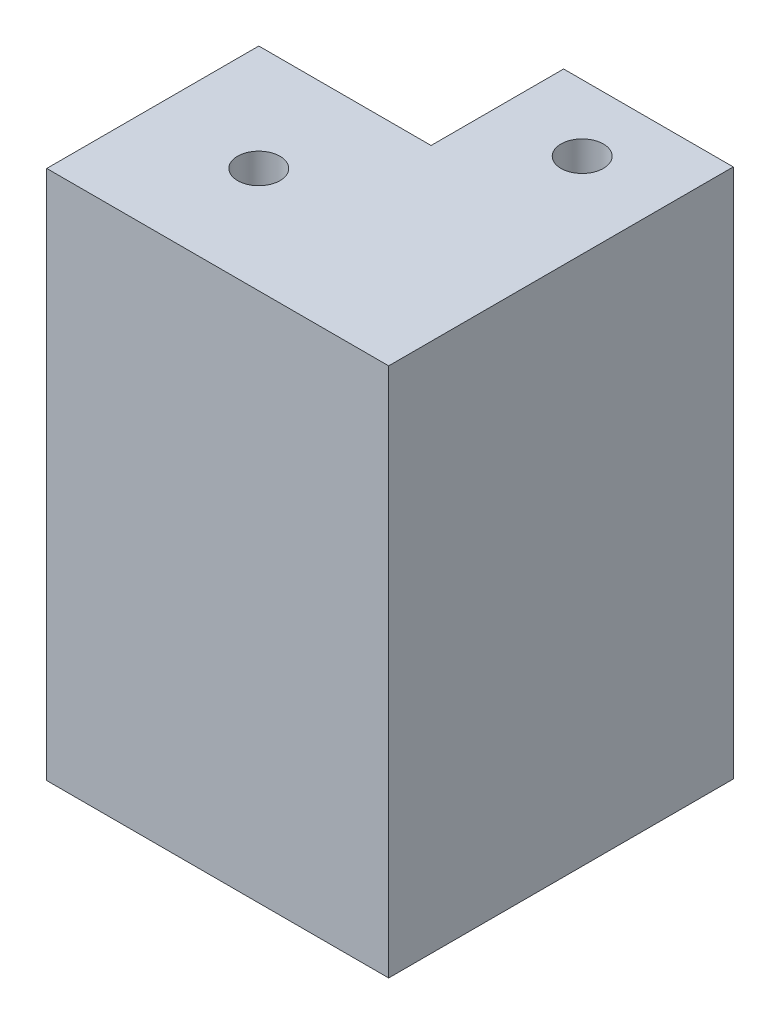
ISO-10303-21;
HEADER;
FILE_DESCRIPTION(('STEP AP214'),'2;1');
FILE_NAME('part.step','',(''),(''),'','','');
FILE_SCHEMA(('AUTOMOTIVE_DESIGN { 1 0 10303 214 1 1 1 1 }'));
ENDSEC;
DATA;
#1=APPLICATION_CONTEXT('core data for automotive mechanical design processes');
#2=APPLICATION_PROTOCOL_DEFINITION('international standard','automotive_design',2000,#1);
#3=PRODUCT_CONTEXT('',#1,'mechanical');
#4=PRODUCT('Part','Part','',(#3));
#5=PRODUCT_RELATED_PRODUCT_CATEGORY('part','',(#4));
#6=PRODUCT_DEFINITION_FORMATION('','',#4);
#7=PRODUCT_DEFINITION_CONTEXT('part definition',#1,'design');
#8=PRODUCT_DEFINITION('design','',#6,#7);
#9=PRODUCT_DEFINITION_SHAPE('','',#8);
#10=(LENGTH_UNIT() NAMED_UNIT(*) SI_UNIT(.MILLI.,.METRE.));
#11=(NAMED_UNIT(*) PLANE_ANGLE_UNIT() SI_UNIT($,.RADIAN.));
#12=(NAMED_UNIT(*) SI_UNIT($,.STERADIAN.) SOLID_ANGLE_UNIT());
#13=UNCERTAINTY_MEASURE_WITH_UNIT(LENGTH_MEASURE(1.E-05),#10,'distance_accuracy_value','');
#14=(GEOMETRIC_REPRESENTATION_CONTEXT(3) GLOBAL_UNCERTAINTY_ASSIGNED_CONTEXT((#13)) GLOBAL_UNIT_ASSIGNED_CONTEXT((#10,
#11,#12)) REPRESENTATION_CONTEXT('',''));
#15=CARTESIAN_POINT('',(0.,0.,0.));
#16=DIRECTION('',(0.,0.,1.));
#17=DIRECTION('',(1.,0.,0.));
#18=AXIS2_PLACEMENT_3D('',#15,#16,#17);
#19=CARTESIAN_POINT('',(0.,100.,0.));
#20=DIRECTION('',(0.,-1.,0.));
#21=DIRECTION('',(0.,0.,-1.));
#22=AXIS2_PLACEMENT_3D('',#19,#20,#21);
#23=PLANE('',#22);
#24=DIRECTION('',(0.,0.,1.));
#25=VECTOR('',#24,1.);
#26=CARTESIAN_POINT('',(0.,100.,0.));
#27=LINE('',#26,#25);
#28=CARTESIAN_POINT('',(0.,100.,-25.));
#29=VERTEX_POINT('',#28);
#30=CARTESIAN_POINT('',(0.,100.,0.));
#31=VERTEX_POINT('',#30);
#32=EDGE_CURVE('E140',#29,#31,#27,.T.);
#33=ORIENTED_EDGE('',*,*,#32,.T.);
#34=DIRECTION('',(-1.,0.,0.));
#35=VECTOR('',#34,1.);
#36=CARTESIAN_POINT('',(-32.5,100.,0.));
#37=LINE('',#36,#35);
#38=CARTESIAN_POINT('',(-32.5,100.,0.));
#39=VERTEX_POINT('',#38);
#40=EDGE_CURVE('E98',#31,#39,#37,.T.);
#41=ORIENTED_EDGE('',*,*,#40,.T.);
#42=DIRECTION('',(0.,0.,1.));
#43=VECTOR('',#42,1.);
#44=CARTESIAN_POINT('',(-32.5,100.,40.));
#45=LINE('',#44,#43);
#46=CARTESIAN_POINT('',(-32.5,100.,40.));
#47=VERTEX_POINT('',#46);
#48=EDGE_CURVE('E111',#39,#47,#45,.T.);
#49=ORIENTED_EDGE('',*,*,#48,.T.);
#50=DIRECTION('',(1.,0.,0.));
#51=VECTOR('',#50,1.);
#52=CARTESIAN_POINT('',(32.,100.,40.));
#53=LINE('',#52,#51);
#54=CARTESIAN_POINT('',(32.,100.,40.));
#55=VERTEX_POINT('',#54);
#56=EDGE_CURVE('E105',#47,#55,#53,.T.);
#57=ORIENTED_EDGE('',*,*,#56,.T.);
#58=DIRECTION('',(0.,0.,-1.));
#59=VECTOR('',#58,1.);
#60=CARTESIAN_POINT('',(32.,100.,-25.));
#61=LINE('',#60,#59);
#62=CARTESIAN_POINT('',(32.,100.,-25.));
#63=VERTEX_POINT('',#62);
#64=EDGE_CURVE('E109',#55,#63,#61,.T.);
#65=ORIENTED_EDGE('',*,*,#64,.T.);
#66=DIRECTION('',(-1.,0.,0.));
#67=VECTOR('',#66,1.);
#68=CARTESIAN_POINT('',(0.,100.,-25.));
#69=LINE('',#68,#67);
#70=EDGE_CURVE('E61',#63,#29,#69,.T.);
#71=ORIENTED_EDGE('',*,*,#70,.T.);
#72=EDGE_LOOP('',(#33,#41,#49,#57,#65,#71));
#73=FACE_BOUND('',#72,.T.);
#74=CARTESIAN_POINT('',(-12.5,100.,20.));
#75=DIRECTION('',(0.,1.,0.));
#76=DIRECTION('',(0.,0.,-1.));
#77=AXIS2_PLACEMENT_3D('',#74,#75,#76);
#78=CIRCLE('',#77,3.9999999999999);
#79=CARTESIAN_POINT('',(-12.5,100.,16.0000000000001));
#80=VERTEX_POINT('',#79);
#81=EDGE_CURVE('E133',#80,#80,#78,.T.);
#82=ORIENTED_EDGE('',*,*,#81,.F.);
#83=EDGE_LOOP('',(#82));
#84=FACE_BOUND('',#83,.T.);
#85=CARTESIAN_POINT('',(16.,100.,-12.5));
#86=DIRECTION('',(0.,1.,0.));
#87=DIRECTION('',(0.,0.,-1.));
#88=AXIS2_PLACEMENT_3D('',#85,#86,#87);
#89=CIRCLE('',#88,4.);
#90=CARTESIAN_POINT('',(16.,100.,-16.5));
#91=VERTEX_POINT('',#90);
#92=EDGE_CURVE('E147',#91,#91,#89,.T.);
#93=ORIENTED_EDGE('',*,*,#92,.F.);
#94=EDGE_LOOP('',(#93));
#95=FACE_BOUND('',#94,.T.);
#96=ADVANCED_FACE('F42',(#73,#84,#95),#23,.F.);
#97=CARTESIAN_POINT('',(0.,0.,0.));
#98=DIRECTION('',(0.,-1.,0.));
#99=DIRECTION('',(0.,0.,-1.));
#100=AXIS2_PLACEMENT_3D('',#97,#98,#99);
#101=PLANE('',#100);
#102=CARTESIAN_POINT('',(16.,0.,-12.5));
#103=DIRECTION('',(0.,-1.,0.));
#104=DIRECTION('',(0.,0.,-1.));
#105=AXIS2_PLACEMENT_3D('',#102,#103,#104);
#106=CIRCLE('',#105,11.);
#107=CARTESIAN_POINT('',(16.,0.,-23.5));
#108=VERTEX_POINT('',#107);
#109=EDGE_CURVE('E238',#108,#108,#106,.T.);
#110=ORIENTED_EDGE('',*,*,#109,.F.);
#111=EDGE_LOOP('',(#110));
#112=FACE_BOUND('',#111,.T.);
#113=CARTESIAN_POINT('',(-12.5,0.,20.));
#114=DIRECTION('',(0.,-1.,0.));
#115=DIRECTION('',(0.,0.,-1.));
#116=AXIS2_PLACEMENT_3D('',#113,#114,#115);
#117=CIRCLE('',#116,16.);
#118=CARTESIAN_POINT('',(-12.5,0.,4.));
#119=VERTEX_POINT('',#118);
#120=EDGE_CURVE('E248',#119,#119,#117,.T.);
#121=ORIENTED_EDGE('',*,*,#120,.F.);
#122=EDGE_LOOP('',(#121));
#123=FACE_BOUND('',#122,.T.);
#124=DIRECTION('',(0.,0.,1.));
#125=VECTOR('',#124,1.);
#126=CARTESIAN_POINT('',(0.,0.,0.));
#127=LINE('',#126,#125);
#128=CARTESIAN_POINT('',(0.,0.,-25.));
#129=VERTEX_POINT('',#128);
#130=CARTESIAN_POINT('',(0.,0.,0.));
#131=VERTEX_POINT('',#130);
#132=EDGE_CURVE('E129',#129,#131,#127,.T.);
#133=ORIENTED_EDGE('',*,*,#132,.F.);
#134=DIRECTION('',(-1.,0.,0.));
#135=VECTOR('',#134,1.);
#136=CARTESIAN_POINT('',(0.,0.,-25.));
#137=LINE('',#136,#135);
#138=CARTESIAN_POINT('',(32.,0.,-25.));
#139=VERTEX_POINT('',#138);
#140=EDGE_CURVE('E90',#139,#129,#137,.T.);
#141=ORIENTED_EDGE('',*,*,#140,.F.);
#142=DIRECTION('',(0.,0.,-1.));
#143=VECTOR('',#142,1.);
#144=CARTESIAN_POINT('',(32.,0.,-25.));
#145=LINE('',#144,#143);
#146=CARTESIAN_POINT('',(32.,0.,40.));
#147=VERTEX_POINT('',#146);
#148=EDGE_CURVE('E84',#147,#139,#145,.T.);
#149=ORIENTED_EDGE('',*,*,#148,.F.);
#150=DIRECTION('',(1.,0.,0.));
#151=VECTOR('',#150,1.);
#152=CARTESIAN_POINT('',(32.,0.,40.));
#153=LINE('',#152,#151);
#154=CARTESIAN_POINT('',(-32.5,0.,40.));
#155=VERTEX_POINT('',#154);
#156=EDGE_CURVE('E119',#155,#147,#153,.T.);
#157=ORIENTED_EDGE('',*,*,#156,.F.);
#158=DIRECTION('',(0.,0.,1.));
#159=VECTOR('',#158,1.);
#160=CARTESIAN_POINT('',(-32.5,0.,40.));
#161=LINE('',#160,#159);
#162=CARTESIAN_POINT('',(-32.5,0.,0.));
#163=VERTEX_POINT('',#162);
#164=EDGE_CURVE('E135',#163,#155,#161,.T.);
#165=ORIENTED_EDGE('',*,*,#164,.F.);
#166=DIRECTION('',(-1.,0.,0.));
#167=VECTOR('',#166,1.);
#168=CARTESIAN_POINT('',(-32.5,0.,0.));
#169=LINE('',#168,#167);
#170=EDGE_CURVE('E132',#131,#163,#169,.T.);
#171=ORIENTED_EDGE('',*,*,#170,.F.);
#172=EDGE_LOOP('',(#133,#141,#149,#157,#165,#171));
#173=FACE_BOUND('',#172,.T.);
#174=ADVANCED_FACE('F174',(#112,#123,#173),#101,.T.);
#175=CARTESIAN_POINT('',(0.,100.,0.));
#176=DIRECTION('',(1.,0.,0.));
#177=DIRECTION('',(0.,0.,-1.));
#178=AXIS2_PLACEMENT_3D('',#175,#176,#177);
#179=PLANE('',#178);
#180=ORIENTED_EDGE('',*,*,#132,.T.);
#181=DIRECTION('',(0.,-1.,0.));
#182=VECTOR('',#181,1.);
#183=CARTESIAN_POINT('',(0.,100.,0.));
#184=LINE('',#183,#182);
#185=EDGE_CURVE('E11',#31,#131,#184,.T.);
#186=ORIENTED_EDGE('',*,*,#185,.F.);
#187=ORIENTED_EDGE('',*,*,#32,.F.);
#188=DIRECTION('',(0.,-1.,0.));
#189=VECTOR('',#188,1.);
#190=CARTESIAN_POINT('',(0.,100.,-25.));
#191=LINE('',#190,#189);
#192=EDGE_CURVE('E125',#29,#129,#191,.T.);
#193=ORIENTED_EDGE('',*,*,#192,.T.);
#194=EDGE_LOOP('',(#180,#186,#187,#193));
#195=FACE_BOUND('',#194,.T.);
#196=ADVANCED_FACE('F44',(#195),#179,.F.);
#197=CARTESIAN_POINT('',(-32.5,100.,0.));
#198=DIRECTION('',(0.,0.,1.));
#199=DIRECTION('',(1.,0.,0.));
#200=AXIS2_PLACEMENT_3D('',#197,#198,#199);
#201=PLANE('',#200);
#202=ORIENTED_EDGE('',*,*,#170,.T.);
#203=DIRECTION('',(0.,-1.,0.));
#204=VECTOR('',#203,1.);
#205=CARTESIAN_POINT('',(-32.5,100.,0.));
#206=LINE('',#205,#204);
#207=EDGE_CURVE('E52',#39,#163,#206,.T.);
#208=ORIENTED_EDGE('',*,*,#207,.F.);
#209=ORIENTED_EDGE('',*,*,#40,.F.);
#210=ORIENTED_EDGE('',*,*,#185,.T.);
#211=EDGE_LOOP('',(#202,#208,#209,#210));
#212=FACE_BOUND('',#211,.T.);
#213=ADVANCED_FACE('F168',(#212),#201,.F.);
#214=CARTESIAN_POINT('',(-32.5,100.,40.));
#215=DIRECTION('',(1.,0.,0.));
#216=DIRECTION('',(0.,0.,-1.));
#217=AXIS2_PLACEMENT_3D('',#214,#215,#216);
#218=PLANE('',#217);
#219=ORIENTED_EDGE('',*,*,#164,.T.);
#220=DIRECTION('',(0.,-1.,0.));
#221=VECTOR('',#220,1.);
#222=CARTESIAN_POINT('',(-32.5,100.,40.));
#223=LINE('',#222,#221);
#224=EDGE_CURVE('E120',#47,#155,#223,.T.);
#225=ORIENTED_EDGE('',*,*,#224,.F.);
#226=ORIENTED_EDGE('',*,*,#48,.F.);
#227=ORIENTED_EDGE('',*,*,#207,.T.);
#228=EDGE_LOOP('',(#219,#225,#226,#227));
#229=FACE_BOUND('',#228,.T.);
#230=ADVANCED_FACE('F171',(#229),#218,.F.);
#231=CARTESIAN_POINT('',(32.,100.,40.));
#232=DIRECTION('',(0.,0.,-1.));
#233=DIRECTION('',(-1.,0.,0.));
#234=AXIS2_PLACEMENT_3D('',#231,#232,#233);
#235=PLANE('',#234);
#236=ORIENTED_EDGE('',*,*,#156,.T.);
#237=DIRECTION('',(0.,-1.,0.));
#238=VECTOR('',#237,1.);
#239=CARTESIAN_POINT('',(32.,100.,40.));
#240=LINE('',#239,#238);
#241=EDGE_CURVE('E116',#55,#147,#240,.T.);
#242=ORIENTED_EDGE('',*,*,#241,.F.);
#243=ORIENTED_EDGE('',*,*,#56,.F.);
#244=ORIENTED_EDGE('',*,*,#224,.T.);
#245=EDGE_LOOP('',(#236,#242,#243,#244));
#246=FACE_BOUND('',#245,.T.);
#247=ADVANCED_FACE('F117',(#246),#235,.F.);
#248=CARTESIAN_POINT('',(32.,100.,-25.));
#249=DIRECTION('',(-1.,0.,0.));
#250=DIRECTION('',(0.,0.,1.));
#251=AXIS2_PLACEMENT_3D('',#248,#249,#250);
#252=PLANE('',#251);
#253=ORIENTED_EDGE('',*,*,#148,.T.);
#254=DIRECTION('',(0.,-1.,0.));
#255=VECTOR('',#254,1.);
#256=CARTESIAN_POINT('',(32.,100.,-25.));
#257=LINE('',#256,#255);
#258=EDGE_CURVE('E121',#63,#139,#257,.T.);
#259=ORIENTED_EDGE('',*,*,#258,.F.);
#260=ORIENTED_EDGE('',*,*,#64,.F.);
#261=ORIENTED_EDGE('',*,*,#241,.T.);
#262=EDGE_LOOP('',(#253,#259,#260,#261));
#263=FACE_BOUND('',#262,.T.);
#264=ADVANCED_FACE('F123',(#263),#252,.F.);
#265=CARTESIAN_POINT('',(0.,100.,-25.));
#266=DIRECTION('',(0.,0.,1.));
#267=DIRECTION('',(1.,0.,0.));
#268=AXIS2_PLACEMENT_3D('',#265,#266,#267);
#269=PLANE('',#268);
#270=ORIENTED_EDGE('',*,*,#140,.T.);
#271=ORIENTED_EDGE('',*,*,#192,.F.);
#272=ORIENTED_EDGE('',*,*,#70,.F.);
#273=ORIENTED_EDGE('',*,*,#258,.T.);
#274=EDGE_LOOP('',(#270,#271,#272,#273));
#275=FACE_BOUND('',#274,.T.);
#276=ADVANCED_FACE('F176',(#275),#269,.F.);
#277=CARTESIAN_POINT('',(-12.5,100.,20.));
#278=DIRECTION('',(0.,-1.,0.));
#279=DIRECTION('',(0.,0.,-1.));
#280=AXIS2_PLACEMENT_3D('',#277,#278,#279);
#281=CYLINDRICAL_SURFACE('',#280,3.9999999999999);
#282=CARTESIAN_POINT('',(-12.5,23.85,20.));
#283=DIRECTION('',(0.,1.,0.));
#284=DIRECTION('',(0.,0.,1.));
#285=AXIS2_PLACEMENT_3D('',#282,#283,#284);
#286=CIRCLE('',#285,3.9999999999999);
#287=CARTESIAN_POINT('',(-12.5,23.85,23.9999999999999));
#288=VERTEX_POINT('',#287);
#289=EDGE_CURVE('E145',#288,#288,#286,.T.);
#290=ORIENTED_EDGE('',*,*,#289,.F.);
#291=EDGE_LOOP('',(#290));
#292=FACE_BOUND('',#291,.T.);
#293=ORIENTED_EDGE('',*,*,#81,.T.);
#294=EDGE_LOOP('',(#293));
#295=FACE_BOUND('',#294,.T.);
#296=ADVANCED_FACE('F178',(#292,#295),#281,.F.);
#297=CARTESIAN_POINT('',(16.,100.,-12.5));
#298=DIRECTION('',(0.,-1.,0.));
#299=DIRECTION('',(0.,0.,-1.));
#300=AXIS2_PLACEMENT_3D('',#297,#298,#299);
#301=CYLINDRICAL_SURFACE('',#300,4.);
#302=CARTESIAN_POINT('',(16.,13.5,-12.5));
#303=DIRECTION('',(0.,1.,0.));
#304=DIRECTION('',(0.,0.,1.));
#305=AXIS2_PLACEMENT_3D('',#302,#303,#304);
#306=CIRCLE('',#305,4.);
#307=CARTESIAN_POINT('',(16.,13.5,-8.49999999999999));
#308=VERTEX_POINT('',#307);
#309=EDGE_CURVE('E46',#308,#308,#306,.T.);
#310=ORIENTED_EDGE('',*,*,#309,.F.);
#311=EDGE_LOOP('',(#310));
#312=FACE_BOUND('',#311,.T.);
#313=ORIENTED_EDGE('',*,*,#92,.T.);
#314=EDGE_LOOP('',(#313));
#315=FACE_BOUND('',#314,.T.);
#316=ADVANCED_FACE('F184',(#312,#315),#301,.F.);
#317=CARTESIAN_POINT('',(-12.5,23.85,20.));
#318=DIRECTION('',(0.,1.,0.));
#319=DIRECTION('',(0.,0.,1.));
#320=AXIS2_PLACEMENT_3D('',#317,#318,#319);
#321=PLANE('',#320);
#322=ORIENTED_EDGE('',*,*,#289,.T.);
#323=EDGE_LOOP('',(#322));
#324=FACE_BOUND('',#323,.T.);
#325=CARTESIAN_POINT('',(-12.5,23.85,20.));
#326=DIRECTION('',(0.,-1.,0.));
#327=DIRECTION('',(0.,0.,-1.));
#328=AXIS2_PLACEMENT_3D('',#325,#326,#327);
#329=CIRCLE('',#328,6.74999999999999);
#330=CARTESIAN_POINT('',(-12.5,23.85,13.25));
#331=VERTEX_POINT('',#330);
#332=EDGE_CURVE('E148',#331,#331,#329,.T.);
#333=ORIENTED_EDGE('',*,*,#332,.T.);
#334=EDGE_LOOP('',(#333));
#335=FACE_BOUND('',#334,.T.);
#336=ADVANCED_FACE('F199',(#324,#335),#321,.F.);
#337=CARTESIAN_POINT('',(-12.5,0.,20.));
#338=DIRECTION('',(0.,-1.,0.));
#339=DIRECTION('',(0.,0.,-1.));
#340=AXIS2_PLACEMENT_3D('',#337,#338,#339);
#341=CYLINDRICAL_SURFACE('',#340,6.75);
#342=ORIENTED_EDGE('',*,*,#332,.F.);
#343=EDGE_LOOP('',(#342));
#344=FACE_BOUND('',#343,.T.);
#345=CARTESIAN_POINT('',(-12.5,5.,20.));
#346=DIRECTION('',(0.,-1.,0.));
#347=DIRECTION('',(0.,0.,-1.));
#348=AXIS2_PLACEMENT_3D('',#345,#346,#347);
#349=CIRCLE('',#348,6.75);
#350=CARTESIAN_POINT('',(-12.5,5.,13.25));
#351=VERTEX_POINT('',#350);
#352=EDGE_CURVE('E154',#351,#351,#349,.T.);
#353=ORIENTED_EDGE('',*,*,#352,.T.);
#354=EDGE_LOOP('',(#353));
#355=FACE_BOUND('',#354,.T.);
#356=ADVANCED_FACE('F203',(#344,#355),#341,.F.);
#357=CARTESIAN_POINT('',(-5.75,5.,20.));
#358=DIRECTION('',(0.,1.,0.));
#359=DIRECTION('',(0.,0.,1.));
#360=AXIS2_PLACEMENT_3D('',#357,#358,#359);
#361=PLANE('',#360);
#362=ORIENTED_EDGE('',*,*,#352,.F.);
#363=EDGE_LOOP('',(#362));
#364=FACE_BOUND('',#363,.T.);
#365=CARTESIAN_POINT('',(-12.5,5.,20.));
#366=DIRECTION('',(0.,-1.,0.));
#367=DIRECTION('',(0.,0.,-1.));
#368=AXIS2_PLACEMENT_3D('',#365,#366,#367);
#369=CIRCLE('',#368,16.);
#370=CARTESIAN_POINT('',(-12.5,5.,4.));
#371=VERTEX_POINT('',#370);
#372=EDGE_CURVE('E159',#371,#371,#369,.T.);
#373=ORIENTED_EDGE('',*,*,#372,.T.);
#374=EDGE_LOOP('',(#373));
#375=FACE_BOUND('',#374,.T.);
#376=ADVANCED_FACE('F206',(#364,#375),#361,.F.);
#377=CARTESIAN_POINT('',(-12.5,0.,20.));
#378=DIRECTION('',(0.,-1.,0.));
#379=DIRECTION('',(0.,0.,-1.));
#380=AXIS2_PLACEMENT_3D('',#377,#378,#379);
#381=CYLINDRICAL_SURFACE('',#380,16.);
#382=ORIENTED_EDGE('',*,*,#372,.F.);
#383=EDGE_LOOP('',(#382));
#384=FACE_BOUND('',#383,.T.);
#385=ORIENTED_EDGE('',*,*,#120,.T.);
#386=EDGE_LOOP('',(#385));
#387=FACE_BOUND('',#386,.T.);
#388=ADVANCED_FACE('F210',(#384,#387),#381,.F.);
#389=CARTESIAN_POINT('',(16.,13.5,-12.5));
#390=DIRECTION('',(0.,1.,0.));
#391=DIRECTION('',(0.,0.,1.));
#392=AXIS2_PLACEMENT_3D('',#389,#390,#391);
#393=PLANE('',#392);
#394=ORIENTED_EDGE('',*,*,#309,.T.);
#395=EDGE_LOOP('',(#394));
#396=FACE_BOUND('',#395,.T.);
#397=CARTESIAN_POINT('',(16.,13.5,-12.5));
#398=DIRECTION('',(0.,-1.,0.));
#399=DIRECTION('',(0.,0.,-1.));
#400=AXIS2_PLACEMENT_3D('',#397,#398,#399);
#401=CIRCLE('',#400,5.1);
#402=CARTESIAN_POINT('',(16.,13.5,-17.6));
#403=VERTEX_POINT('',#402);
#404=EDGE_CURVE('E245',#403,#403,#401,.T.);
#405=ORIENTED_EDGE('',*,*,#404,.T.);
#406=EDGE_LOOP('',(#405));
#407=FACE_BOUND('',#406,.T.);
#408=ADVANCED_FACE('F214',(#396,#407),#393,.F.);
#409=CARTESIAN_POINT('',(16.,0.,-12.5));
#410=DIRECTION('',(0.,-1.,0.));
#411=DIRECTION('',(0.,0.,-1.));
#412=AXIS2_PLACEMENT_3D('',#409,#410,#411);
#413=CYLINDRICAL_SURFACE('',#412,5.1);
#414=ORIENTED_EDGE('',*,*,#404,.F.);
#415=EDGE_LOOP('',(#414));
#416=FACE_BOUND('',#415,.T.);
#417=CARTESIAN_POINT('',(16.,3.5,-12.5));
#418=DIRECTION('',(0.,-1.,0.));
#419=DIRECTION('',(0.,0.,-1.));
#420=AXIS2_PLACEMENT_3D('',#417,#418,#419);
#421=CIRCLE('',#420,5.1);
#422=CARTESIAN_POINT('',(16.,3.5,-17.6));
#423=VERTEX_POINT('',#422);
#424=EDGE_CURVE('E240',#423,#423,#421,.T.);
#425=ORIENTED_EDGE('',*,*,#424,.T.);
#426=EDGE_LOOP('',(#425));
#427=FACE_BOUND('',#426,.T.);
#428=ADVANCED_FACE('F218',(#416,#427),#413,.F.);
#429=CARTESIAN_POINT('',(21.1,3.5,-12.5));
#430=DIRECTION('',(0.,1.,0.));
#431=DIRECTION('',(0.,0.,1.));
#432=AXIS2_PLACEMENT_3D('',#429,#430,#431);
#433=PLANE('',#432);
#434=ORIENTED_EDGE('',*,*,#424,.F.);
#435=EDGE_LOOP('',(#434));
#436=FACE_BOUND('',#435,.T.);
#437=CARTESIAN_POINT('',(16.,3.5,-12.5));
#438=DIRECTION('',(0.,-1.,0.));
#439=DIRECTION('',(0.,0.,-1.));
#440=AXIS2_PLACEMENT_3D('',#437,#438,#439);
#441=CIRCLE('',#440,11.);
#442=CARTESIAN_POINT('',(16.,3.5,-23.5));
#443=VERTEX_POINT('',#442);
#444=EDGE_CURVE('E235',#443,#443,#441,.T.);
#445=ORIENTED_EDGE('',*,*,#444,.T.);
#446=EDGE_LOOP('',(#445));
#447=FACE_BOUND('',#446,.T.);
#448=ADVANCED_FACE('F222',(#436,#447),#433,.F.);
#449=CARTESIAN_POINT('',(16.,0.,-12.5));
#450=DIRECTION('',(0.,-1.,0.));
#451=DIRECTION('',(0.,0.,-1.));
#452=AXIS2_PLACEMENT_3D('',#449,#450,#451);
#453=CYLINDRICAL_SURFACE('',#452,11.);
#454=ORIENTED_EDGE('',*,*,#444,.F.);
#455=EDGE_LOOP('',(#454));
#456=FACE_BOUND('',#455,.T.);
#457=ORIENTED_EDGE('',*,*,#109,.T.);
#458=EDGE_LOOP('',(#457));
#459=FACE_BOUND('',#458,.T.);
#460=ADVANCED_FACE('F226',(#456,#459),#453,.F.);
#461=CLOSED_SHELL('',(#96,#174,#196,#213,#230,#247,#264,#276,#296,#316,#336,#356,#376,#388,#408,
#428,#448,#460));
#462=MANIFOLD_SOLID_BREP('B2',#461);
#463=ADVANCED_BREP_SHAPE_REPRESENTATION('',(#18,#462),#14);
#464=SHAPE_DEFINITION_REPRESENTATION(#9,#463);
ENDSEC;
END-ISO-10303-21;
